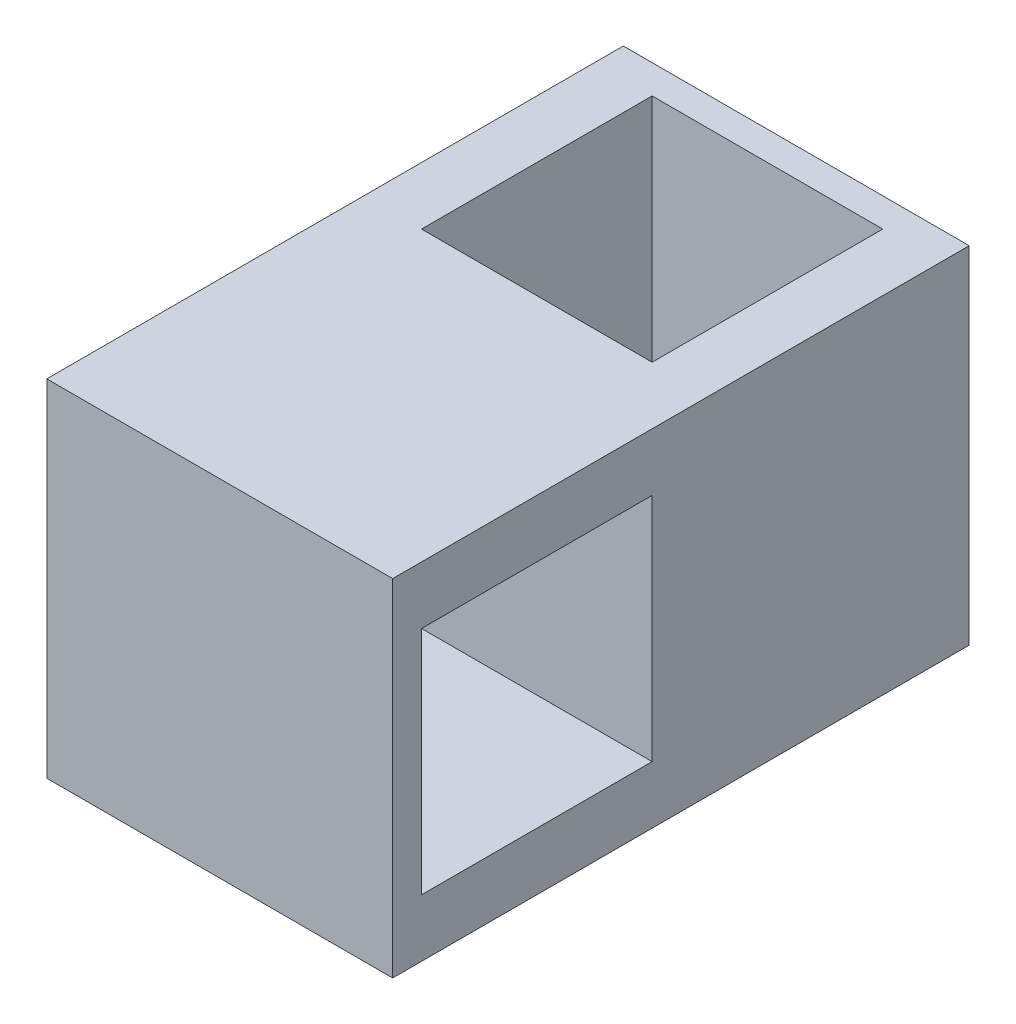
ISO-10303-21;
HEADER;
FILE_DESCRIPTION(('STEP AP214'),'2;1');
FILE_NAME('part.step','',(''),(''),'','','');
FILE_SCHEMA(('AUTOMOTIVE_DESIGN { 1 0 10303 214 1 1 1 1 }'));
ENDSEC;
DATA;
#1=APPLICATION_CONTEXT('core data for automotive mechanical design processes');
#2=APPLICATION_PROTOCOL_DEFINITION('international standard','automotive_design',2000,#1);
#3=PRODUCT_CONTEXT('',#1,'mechanical');
#4=PRODUCT('Part','Part','',(#3));
#5=PRODUCT_RELATED_PRODUCT_CATEGORY('part','',(#4));
#6=PRODUCT_DEFINITION_FORMATION('','',#4);
#7=PRODUCT_DEFINITION_CONTEXT('part definition',#1,'design');
#8=PRODUCT_DEFINITION('design','',#6,#7);
#9=PRODUCT_DEFINITION_SHAPE('','',#8);
#10=(LENGTH_UNIT() NAMED_UNIT(*) SI_UNIT(.MILLI.,.METRE.));
#11=(NAMED_UNIT(*) PLANE_ANGLE_UNIT() SI_UNIT($,.RADIAN.));
#12=(NAMED_UNIT(*) SI_UNIT($,.STERADIAN.) SOLID_ANGLE_UNIT());
#13=UNCERTAINTY_MEASURE_WITH_UNIT(LENGTH_MEASURE(1.E-05),#10,'distance_accuracy_value','');
#14=(GEOMETRIC_REPRESENTATION_CONTEXT(3) GLOBAL_UNCERTAINTY_ASSIGNED_CONTEXT((#13)) GLOBAL_UNIT_ASSIGNED_CONTEXT((#10,
#11,#12)) REPRESENTATION_CONTEXT('',''));
#15=CARTESIAN_POINT('',(0.,0.,0.));
#16=DIRECTION('',(0.,0.,1.));
#17=DIRECTION('',(1.,0.,0.));
#18=AXIS2_PLACEMENT_3D('',#15,#16,#17);
#19=CARTESIAN_POINT('',(15.,-15.,50.));
#20=DIRECTION('',(0.,1.,0.));
#21=DIRECTION('',(-1.,0.,0.));
#22=AXIS2_PLACEMENT_3D('',#19,#20,#21);
#23=PLANE('',#22);
#24=DIRECTION('',(1.,0.,0.));
#25=VECTOR('',#24,1.);
#26=CARTESIAN_POINT('',(15.,-15.,0.));
#27=LINE('',#26,#25);
#28=CARTESIAN_POINT('',(-15.,-15.,0.));
#29=VERTEX_POINT('',#28);
#30=CARTESIAN_POINT('',(15.,-15.,0.));
#31=VERTEX_POINT('',#30);
#32=EDGE_CURVE('E243',#29,#31,#27,.T.);
#33=ORIENTED_EDGE('',*,*,#32,.T.);
#34=DIRECTION('',(0.,0.,-1.));
#35=VECTOR('',#34,1.);
#36=CARTESIAN_POINT('',(15.,-15.,50.));
#37=LINE('',#36,#35);
#38=CARTESIAN_POINT('',(15.,-15.,50.));
#39=VERTEX_POINT('',#38);
#40=EDGE_CURVE('E54',#39,#31,#37,.T.);
#41=ORIENTED_EDGE('',*,*,#40,.F.);
#42=DIRECTION('',(1.,0.,0.));
#43=VECTOR('',#42,1.);
#44=CARTESIAN_POINT('',(15.,-15.,50.));
#45=LINE('',#44,#43);
#46=CARTESIAN_POINT('',(-15.,-15.,50.));
#47=VERTEX_POINT('',#46);
#48=EDGE_CURVE('E229',#47,#39,#45,.T.);
#49=ORIENTED_EDGE('',*,*,#48,.F.);
#50=DIRECTION('',(0.,0.,-1.));
#51=VECTOR('',#50,1.);
#52=CARTESIAN_POINT('',(-15.,-15.,50.));
#53=LINE('',#52,#51);
#54=EDGE_CURVE('E11',#47,#29,#53,.T.);
#55=ORIENTED_EDGE('',*,*,#54,.T.);
#56=EDGE_LOOP('',(#33,#41,#49,#55));
#57=FACE_BOUND('',#56,.T.);
#58=DIRECTION('',(0.,0.,-1.));
#59=VECTOR('',#58,1.);
#60=CARTESIAN_POINT('',(-10.,-15.,0.));
#61=LINE('',#60,#59);
#62=CARTESIAN_POINT('',(-9.99999999999999,-15.,22.5));
#63=VERTEX_POINT('',#62);
#64=CARTESIAN_POINT('',(-10.,-15.,2.50000000000001));
#65=VERTEX_POINT('',#64);
#66=EDGE_CURVE('E144',#63,#65,#61,.T.);
#67=ORIENTED_EDGE('',*,*,#66,.F.);
#68=DIRECTION('',(-1.,0.,0.));
#69=VECTOR('',#68,1.);
#70=CARTESIAN_POINT('',(0.,-15.,22.5));
#71=LINE('',#70,#69);
#72=CARTESIAN_POINT('',(10.,-15.,22.5));
#73=VERTEX_POINT('',#72);
#74=EDGE_CURVE('E135',#73,#63,#71,.T.);
#75=ORIENTED_EDGE('',*,*,#74,.F.);
#76=DIRECTION('',(0.,0.,-1.));
#77=VECTOR('',#76,1.);
#78=CARTESIAN_POINT('',(10.,-15.,0.));
#79=LINE('',#78,#77);
#80=CARTESIAN_POINT('',(10.,-15.,2.5));
#81=VERTEX_POINT('',#80);
#82=EDGE_CURVE('E61',#73,#81,#79,.T.);
#83=ORIENTED_EDGE('',*,*,#82,.T.);
#84=DIRECTION('',(-1.,0.,0.));
#85=VECTOR('',#84,1.);
#86=CARTESIAN_POINT('',(0.,-15.,2.50000000000001));
#87=LINE('',#86,#85);
#88=EDGE_CURVE('E149',#81,#65,#87,.T.);
#89=ORIENTED_EDGE('',*,*,#88,.T.);
#90=EDGE_LOOP('',(#67,#75,#83,#89));
#91=FACE_BOUND('',#90,.T.);
#92=ADVANCED_FACE('F45',(#57,#91),#23,.F.);
#93=CARTESIAN_POINT('',(15.,15.,50.));
#94=DIRECTION('',(0.,-1.,0.));
#95=DIRECTION('',(1.,0.,0.));
#96=AXIS2_PLACEMENT_3D('',#93,#94,#95);
#97=PLANE('',#96);
#98=DIRECTION('',(-1.,0.,0.));
#99=VECTOR('',#98,1.);
#100=CARTESIAN_POINT('',(15.,15.,0.));
#101=LINE('',#100,#99);
#102=CARTESIAN_POINT('',(15.,15.,0.));
#103=VERTEX_POINT('',#102);
#104=CARTESIAN_POINT('',(-15.,15.,0.));
#105=VERTEX_POINT('',#104);
#106=EDGE_CURVE('E230',#103,#105,#101,.T.);
#107=ORIENTED_EDGE('',*,*,#106,.T.);
#108=DIRECTION('',(0.,0.,-1.));
#109=VECTOR('',#108,1.);
#110=CARTESIAN_POINT('',(-15.,15.,50.));
#111=LINE('',#110,#109);
#112=CARTESIAN_POINT('',(-15.,15.,50.));
#113=VERTEX_POINT('',#112);
#114=EDGE_CURVE('E239',#113,#105,#111,.T.);
#115=ORIENTED_EDGE('',*,*,#114,.F.);
#116=DIRECTION('',(-1.,0.,0.));
#117=VECTOR('',#116,1.);
#118=CARTESIAN_POINT('',(15.,15.,50.));
#119=LINE('',#118,#117);
#120=CARTESIAN_POINT('',(15.,15.,50.));
#121=VERTEX_POINT('',#120);
#122=EDGE_CURVE('E236',#121,#113,#119,.T.);
#123=ORIENTED_EDGE('',*,*,#122,.F.);
#124=DIRECTION('',(0.,0.,-1.));
#125=VECTOR('',#124,1.);
#126=CARTESIAN_POINT('',(15.,15.,50.));
#127=LINE('',#126,#125);
#128=EDGE_CURVE('E254',#121,#103,#127,.T.);
#129=ORIENTED_EDGE('',*,*,#128,.T.);
#130=EDGE_LOOP('',(#107,#115,#123,#129));
#131=FACE_BOUND('',#130,.T.);
#132=DIRECTION('',(0.,0.,-1.));
#133=VECTOR('',#132,1.);
#134=CARTESIAN_POINT('',(-10.,15.,0.));
#135=LINE('',#134,#133);
#136=CARTESIAN_POINT('',(-9.99999999999999,15.,22.5));
#137=VERTEX_POINT('',#136);
#138=CARTESIAN_POINT('',(-10.,15.,2.50000000000001));
#139=VERTEX_POINT('',#138);
#140=EDGE_CURVE('E69',#137,#139,#135,.T.);
#141=ORIENTED_EDGE('',*,*,#140,.T.);
#142=DIRECTION('',(-1.,0.,0.));
#143=VECTOR('',#142,1.);
#144=CARTESIAN_POINT('',(0.,15.,2.50000000000001));
#145=LINE('',#144,#143);
#146=CARTESIAN_POINT('',(10.,15.,2.5));
#147=VERTEX_POINT('',#146);
#148=EDGE_CURVE('E154',#147,#139,#145,.T.);
#149=ORIENTED_EDGE('',*,*,#148,.F.);
#150=DIRECTION('',(0.,0.,-1.));
#151=VECTOR('',#150,1.);
#152=CARTESIAN_POINT('',(10.,15.,0.));
#153=LINE('',#152,#151);
#154=CARTESIAN_POINT('',(10.,15.,22.5));
#155=VERTEX_POINT('',#154);
#156=EDGE_CURVE('E158',#155,#147,#153,.T.);
#157=ORIENTED_EDGE('',*,*,#156,.F.);
#158=DIRECTION('',(-1.,0.,0.));
#159=VECTOR('',#158,1.);
#160=CARTESIAN_POINT('',(0.,15.,22.5));
#161=LINE('',#160,#159);
#162=EDGE_CURVE('E167',#155,#137,#161,.T.);
#163=ORIENTED_EDGE('',*,*,#162,.T.);
#164=EDGE_LOOP('',(#141,#149,#157,#163));
#165=FACE_BOUND('',#164,.T.);
#166=ADVANCED_FACE('F273',(#131,#165),#97,.F.);
#167=CARTESIAN_POINT('',(-15.,-15.,50.));
#168=DIRECTION('',(1.,0.,0.));
#169=DIRECTION('',(0.,0.,-1.));
#170=AXIS2_PLACEMENT_3D('',#167,#168,#169);
#171=PLANE('',#170);
#172=DIRECTION('',(0.,-1.,0.));
#173=VECTOR('',#172,1.);
#174=CARTESIAN_POINT('',(-15.,-15.,0.));
#175=LINE('',#174,#173);
#176=EDGE_CURVE('E215',#105,#29,#175,.T.);
#177=ORIENTED_EDGE('',*,*,#176,.T.);
#178=ORIENTED_EDGE('',*,*,#54,.F.);
#179=DIRECTION('',(0.,-1.,0.));
#180=VECTOR('',#179,1.);
#181=CARTESIAN_POINT('',(-15.,-15.,50.));
#182=LINE('',#181,#180);
#183=EDGE_CURVE('E225',#113,#47,#182,.T.);
#184=ORIENTED_EDGE('',*,*,#183,.F.);
#185=ORIENTED_EDGE('',*,*,#114,.T.);
#186=EDGE_LOOP('',(#177,#178,#184,#185));
#187=FACE_BOUND('',#186,.T.);
#188=DIRECTION('',(0.,1.,0.));
#189=VECTOR('',#188,1.);
#190=CARTESIAN_POINT('',(-15.,0.,27.5));
#191=LINE('',#190,#189);
#192=CARTESIAN_POINT('',(-15.,-10.,27.5));
#193=VERTEX_POINT('',#192);
#194=CARTESIAN_POINT('',(-15.,10.,27.5));
#195=VERTEX_POINT('',#194);
#196=EDGE_CURVE('E176',#193,#195,#191,.T.);
#197=ORIENTED_EDGE('',*,*,#196,.T.);
#198=DIRECTION('',(0.,0.,-1.));
#199=VECTOR('',#198,1.);
#200=CARTESIAN_POINT('',(-15.,9.99999999999999,0.));
#201=LINE('',#200,#199);
#202=CARTESIAN_POINT('',(-15.,10.,47.5));
#203=VERTEX_POINT('',#202);
#204=EDGE_CURVE('E186',#203,#195,#201,.T.);
#205=ORIENTED_EDGE('',*,*,#204,.F.);
#206=DIRECTION('',(0.,1.,0.));
#207=VECTOR('',#206,1.);
#208=CARTESIAN_POINT('',(-15.,0.,47.5));
#209=LINE('',#208,#207);
#210=CARTESIAN_POINT('',(-15.,-10.,47.5));
#211=VERTEX_POINT('',#210);
#212=EDGE_CURVE('E205',#211,#203,#209,.T.);
#213=ORIENTED_EDGE('',*,*,#212,.F.);
#214=DIRECTION('',(0.,0.,-1.));
#215=VECTOR('',#214,1.);
#216=CARTESIAN_POINT('',(-15.,-10.,0.));
#217=LINE('',#216,#215);
#218=EDGE_CURVE('E201',#211,#193,#217,.T.);
#219=ORIENTED_EDGE('',*,*,#218,.T.);
#220=EDGE_LOOP('',(#197,#205,#213,#219));
#221=FACE_BOUND('',#220,.T.);
#222=ADVANCED_FACE('F47',(#187,#221),#171,.F.);
#223=CARTESIAN_POINT('',(15.,-15.,50.));
#224=DIRECTION('',(-1.,0.,0.));
#225=DIRECTION('',(0.,0.,1.));
#226=AXIS2_PLACEMENT_3D('',#223,#224,#225);
#227=PLANE('',#226);
#228=DIRECTION('',(0.,1.,0.));
#229=VECTOR('',#228,1.);
#230=CARTESIAN_POINT('',(15.,-15.,0.));
#231=LINE('',#230,#229);
#232=EDGE_CURVE('E246',#31,#103,#231,.T.);
#233=ORIENTED_EDGE('',*,*,#232,.T.);
#234=ORIENTED_EDGE('',*,*,#128,.F.);
#235=DIRECTION('',(0.,1.,0.));
#236=VECTOR('',#235,1.);
#237=CARTESIAN_POINT('',(15.,-15.,50.));
#238=LINE('',#237,#236);
#239=EDGE_CURVE('E233',#39,#121,#238,.T.);
#240=ORIENTED_EDGE('',*,*,#239,.F.);
#241=ORIENTED_EDGE('',*,*,#40,.T.);
#242=EDGE_LOOP('',(#233,#234,#240,#241));
#243=FACE_BOUND('',#242,.T.);
#244=DIRECTION('',(0.,1.,0.));
#245=VECTOR('',#244,1.);
#246=CARTESIAN_POINT('',(15.,0.,27.5));
#247=LINE('',#246,#245);
#248=CARTESIAN_POINT('',(15.,-10.,27.5));
#249=VERTEX_POINT('',#248);
#250=CARTESIAN_POINT('',(15.,10.,27.5));
#251=VERTEX_POINT('',#250);
#252=EDGE_CURVE('E182',#249,#251,#247,.T.);
#253=ORIENTED_EDGE('',*,*,#252,.F.);
#254=DIRECTION('',(0.,0.,-1.));
#255=VECTOR('',#254,1.);
#256=CARTESIAN_POINT('',(15.,-10.,0.));
#257=LINE('',#256,#255);
#258=CARTESIAN_POINT('',(15.,-10.,47.5));
#259=VERTEX_POINT('',#258);
#260=EDGE_CURVE('E185',#259,#249,#257,.T.);
#261=ORIENTED_EDGE('',*,*,#260,.F.);
#262=DIRECTION('',(0.,1.,0.));
#263=VECTOR('',#262,1.);
#264=CARTESIAN_POINT('',(15.,0.,47.5));
#265=LINE('',#264,#263);
#266=CARTESIAN_POINT('',(15.,10.,47.5));
#267=VERTEX_POINT('',#266);
#268=EDGE_CURVE('E189',#259,#267,#265,.T.);
#269=ORIENTED_EDGE('',*,*,#268,.T.);
#270=DIRECTION('',(0.,0.,-1.));
#271=VECTOR('',#270,1.);
#272=CARTESIAN_POINT('',(15.,9.99999999999999,0.));
#273=LINE('',#272,#271);
#274=EDGE_CURVE('E193',#267,#251,#273,.T.);
#275=ORIENTED_EDGE('',*,*,#274,.T.);
#276=EDGE_LOOP('',(#253,#261,#269,#275));
#277=FACE_BOUND('',#276,.T.);
#278=ADVANCED_FACE('F263',(#243,#277),#227,.F.);
#279=CARTESIAN_POINT('',(0.,0.,50.));
#280=DIRECTION('',(0.,0.,1.));
#281=DIRECTION('',(1.,0.,0.));
#282=AXIS2_PLACEMENT_3D('',#279,#280,#281);
#283=PLANE('',#282);
#284=ORIENTED_EDGE('',*,*,#183,.T.);
#285=ORIENTED_EDGE('',*,*,#48,.T.);
#286=ORIENTED_EDGE('',*,*,#239,.T.);
#287=ORIENTED_EDGE('',*,*,#122,.T.);
#288=EDGE_LOOP('',(#284,#285,#286,#287));
#289=FACE_BOUND('',#288,.T.);
#290=ADVANCED_FACE('F281',(#289),#283,.T.);
#291=CARTESIAN_POINT('',(0.,0.,0.));
#292=DIRECTION('',(0.,0.,1.));
#293=DIRECTION('',(1.,0.,0.));
#294=AXIS2_PLACEMENT_3D('',#291,#292,#293);
#295=PLANE('',#294);
#296=ORIENTED_EDGE('',*,*,#176,.F.);
#297=ORIENTED_EDGE('',*,*,#106,.F.);
#298=ORIENTED_EDGE('',*,*,#232,.F.);
#299=ORIENTED_EDGE('',*,*,#32,.F.);
#300=EDGE_LOOP('',(#296,#297,#298,#299));
#301=FACE_BOUND('',#300,.T.);
#302=ADVANCED_FACE('F270',(#301),#295,.F.);
#303=CARTESIAN_POINT('',(15.,0.,27.5));
#304=DIRECTION('',(0.,0.,1.));
#305=DIRECTION('',(1.,0.,0.));
#306=AXIS2_PLACEMENT_3D('',#303,#304,#305);
#307=PLANE('',#306);
#308=ORIENTED_EDGE('',*,*,#196,.F.);
#309=DIRECTION('',(-1.,0.,0.));
#310=VECTOR('',#309,1.);
#311=CARTESIAN_POINT('',(15.,-10.,27.5));
#312=LINE('',#311,#310);
#313=EDGE_CURVE('E197',#249,#193,#312,.T.);
#314=ORIENTED_EDGE('',*,*,#313,.F.);
#315=ORIENTED_EDGE('',*,*,#252,.T.);
#316=DIRECTION('',(-1.,0.,0.));
#317=VECTOR('',#316,1.);
#318=CARTESIAN_POINT('',(15.,10.,27.5));
#319=LINE('',#318,#317);
#320=EDGE_CURVE('E212',#251,#195,#319,.T.);
#321=ORIENTED_EDGE('',*,*,#320,.T.);
#322=EDGE_LOOP('',(#308,#314,#315,#321));
#323=FACE_BOUND('',#322,.T.);
#324=ADVANCED_FACE('F293',(#323),#307,.T.);
#325=CARTESIAN_POINT('',(15.,9.99999999999999,0.));
#326=DIRECTION('',(0.,1.,0.));
#327=DIRECTION('',(0.,0.,1.));
#328=AXIS2_PLACEMENT_3D('',#325,#326,#327);
#329=PLANE('',#328);
#330=ORIENTED_EDGE('',*,*,#204,.T.);
#331=ORIENTED_EDGE('',*,*,#320,.F.);
#332=ORIENTED_EDGE('',*,*,#274,.F.);
#333=DIRECTION('',(-1.,0.,0.));
#334=VECTOR('',#333,1.);
#335=CARTESIAN_POINT('',(15.,10.,47.5));
#336=LINE('',#335,#334);
#337=EDGE_CURVE('E216',#267,#203,#336,.T.);
#338=ORIENTED_EDGE('',*,*,#337,.T.);
#339=EDGE_LOOP('',(#330,#331,#332,#338));
#340=FACE_BOUND('',#339,.T.);
#341=ADVANCED_FACE('F298',(#340),#329,.F.);
#342=CARTESIAN_POINT('',(15.,0.,47.5));
#343=DIRECTION('',(0.,0.,1.));
#344=DIRECTION('',(1.,0.,0.));
#345=AXIS2_PLACEMENT_3D('',#342,#343,#344);
#346=PLANE('',#345);
#347=ORIENTED_EDGE('',*,*,#212,.T.);
#348=ORIENTED_EDGE('',*,*,#337,.F.);
#349=ORIENTED_EDGE('',*,*,#268,.F.);
#350=DIRECTION('',(-1.,0.,0.));
#351=VECTOR('',#350,1.);
#352=CARTESIAN_POINT('',(15.,-10.,47.5));
#353=LINE('',#352,#351);
#354=EDGE_CURVE('E219',#259,#211,#353,.T.);
#355=ORIENTED_EDGE('',*,*,#354,.T.);
#356=EDGE_LOOP('',(#347,#348,#349,#355));
#357=FACE_BOUND('',#356,.T.);
#358=ADVANCED_FACE('F302',(#357),#346,.F.);
#359=CARTESIAN_POINT('',(15.,-10.,0.));
#360=DIRECTION('',(0.,1.,0.));
#361=DIRECTION('',(0.,0.,1.));
#362=AXIS2_PLACEMENT_3D('',#359,#360,#361);
#363=PLANE('',#362);
#364=ORIENTED_EDGE('',*,*,#218,.F.);
#365=ORIENTED_EDGE('',*,*,#354,.F.);
#366=ORIENTED_EDGE('',*,*,#260,.T.);
#367=ORIENTED_EDGE('',*,*,#313,.T.);
#368=EDGE_LOOP('',(#364,#365,#366,#367));
#369=FACE_BOUND('',#368,.T.);
#370=ADVANCED_FACE('F300',(#369),#363,.T.);
#371=CARTESIAN_POINT('',(-10.,-15.,0.));
#372=DIRECTION('',(1.,0.,0.));
#373=DIRECTION('',(0.,0.,-1.));
#374=AXIS2_PLACEMENT_3D('',#371,#372,#373);
#375=PLANE('',#374);
#376=ORIENTED_EDGE('',*,*,#140,.F.);
#377=DIRECTION('',(0.,1.,0.));
#378=VECTOR('',#377,1.);
#379=CARTESIAN_POINT('',(-9.99999999999999,-15.,22.5));
#380=LINE('',#379,#378);
#381=EDGE_CURVE('E138',#63,#137,#380,.T.);
#382=ORIENTED_EDGE('',*,*,#381,.F.);
#383=ORIENTED_EDGE('',*,*,#66,.T.);
#384=DIRECTION('',(0.,1.,0.));
#385=VECTOR('',#384,1.);
#386=CARTESIAN_POINT('',(-10.,-15.,2.50000000000001));
#387=LINE('',#386,#385);
#388=EDGE_CURVE('E173',#65,#139,#387,.T.);
#389=ORIENTED_EDGE('',*,*,#388,.T.);
#390=EDGE_LOOP('',(#376,#382,#383,#389));
#391=FACE_BOUND('',#390,.T.);
#392=ADVANCED_FACE('F146',(#391),#375,.T.);
#393=CARTESIAN_POINT('',(0.,-15.,2.50000000000001));
#394=DIRECTION('',(0.,0.,-1.));
#395=DIRECTION('',(-1.,0.,0.));
#396=AXIS2_PLACEMENT_3D('',#393,#394,#395);
#397=PLANE('',#396);
#398=ORIENTED_EDGE('',*,*,#148,.T.);
#399=ORIENTED_EDGE('',*,*,#388,.F.);
#400=ORIENTED_EDGE('',*,*,#88,.F.);
#401=DIRECTION('',(0.,1.,0.));
#402=VECTOR('',#401,1.);
#403=CARTESIAN_POINT('',(10.,-15.,2.5));
#404=LINE('',#403,#402);
#405=EDGE_CURVE('E177',#81,#147,#404,.T.);
#406=ORIENTED_EDGE('',*,*,#405,.T.);
#407=EDGE_LOOP('',(#398,#399,#400,#406));
#408=FACE_BOUND('',#407,.T.);
#409=ADVANCED_FACE('F312',(#408),#397,.F.);
#410=CARTESIAN_POINT('',(10.,-15.,0.));
#411=DIRECTION('',(1.,0.,0.));
#412=DIRECTION('',(0.,1.,0.));
#413=AXIS2_PLACEMENT_3D('',#410,#411,#412);
#414=PLANE('',#413);
#415=ORIENTED_EDGE('',*,*,#156,.T.);
#416=ORIENTED_EDGE('',*,*,#405,.F.);
#417=ORIENTED_EDGE('',*,*,#82,.F.);
#418=DIRECTION('',(0.,1.,0.));
#419=VECTOR('',#418,1.);
#420=CARTESIAN_POINT('',(10.,-15.,22.5));
#421=LINE('',#420,#419);
#422=EDGE_CURVE('E140',#73,#155,#421,.T.);
#423=ORIENTED_EDGE('',*,*,#422,.T.);
#424=EDGE_LOOP('',(#415,#416,#417,#423));
#425=FACE_BOUND('',#424,.T.);
#426=ADVANCED_FACE('F315',(#425),#414,.F.);
#427=CARTESIAN_POINT('',(0.,-15.,22.5));
#428=DIRECTION('',(0.,0.,-1.));
#429=DIRECTION('',(-1.,0.,0.));
#430=AXIS2_PLACEMENT_3D('',#427,#428,#429);
#431=PLANE('',#430);
#432=ORIENTED_EDGE('',*,*,#162,.F.);
#433=ORIENTED_EDGE('',*,*,#422,.F.);
#434=ORIENTED_EDGE('',*,*,#74,.T.);
#435=ORIENTED_EDGE('',*,*,#381,.T.);
#436=EDGE_LOOP('',(#432,#433,#434,#435));
#437=FACE_BOUND('',#436,.T.);
#438=ADVANCED_FACE('F137',(#437),#431,.T.);
#439=CLOSED_SHELL('',(#92,#166,#222,#278,#290,#302,#324,#341,#358,#370,#392,#409,#426,#438));
#440=MANIFOLD_SOLID_BREP('B2',#439);
#441=ADVANCED_BREP_SHAPE_REPRESENTATION('',(#18,#440),#14);
#442=SHAPE_DEFINITION_REPRESENTATION(#9,#441);
ENDSEC;
END-ISO-10303-21;
